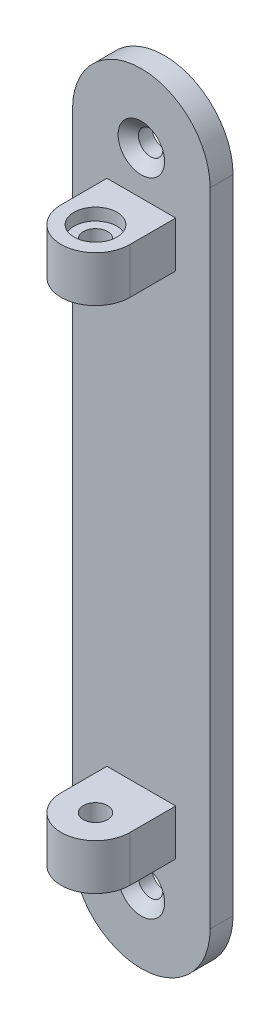
ISO-10303-21;
HEADER;
FILE_DESCRIPTION(('STEP AP214'),'2;1');
FILE_NAME('part.step','',(''),(''),'','','');
FILE_SCHEMA(('AUTOMOTIVE_DESIGN { 1 0 10303 214 1 1 1 1 }'));
ENDSEC;
DATA;
#1=APPLICATION_CONTEXT('core data for automotive mechanical design processes');
#2=APPLICATION_PROTOCOL_DEFINITION('international standard','automotive_design',2000,#1);
#3=PRODUCT_CONTEXT('',#1,'mechanical');
#4=PRODUCT('Part','Part','',(#3));
#5=PRODUCT_RELATED_PRODUCT_CATEGORY('part','',(#4));
#6=PRODUCT_DEFINITION_FORMATION('','',#4);
#7=PRODUCT_DEFINITION_CONTEXT('part definition',#1,'design');
#8=PRODUCT_DEFINITION('design','',#6,#7);
#9=PRODUCT_DEFINITION_SHAPE('','',#8);
#10=(LENGTH_UNIT() NAMED_UNIT(*) SI_UNIT(.MILLI.,.METRE.));
#11=(NAMED_UNIT(*) PLANE_ANGLE_UNIT() SI_UNIT($,.RADIAN.));
#12=(NAMED_UNIT(*) SI_UNIT($,.STERADIAN.) SOLID_ANGLE_UNIT());
#13=UNCERTAINTY_MEASURE_WITH_UNIT(LENGTH_MEASURE(1.E-05),#10,'distance_accuracy_value','');
#14=(GEOMETRIC_REPRESENTATION_CONTEXT(3) GLOBAL_UNCERTAINTY_ASSIGNED_CONTEXT((#13)) GLOBAL_UNIT_ASSIGNED_CONTEXT((#10,
#11,#12)) REPRESENTATION_CONTEXT('',''));
#15=CARTESIAN_POINT('',(0.,0.,0.));
#16=DIRECTION('',(0.,0.,1.));
#17=DIRECTION('',(1.,0.,0.));
#18=AXIS2_PLACEMENT_3D('',#15,#16,#17);
#19=CARTESIAN_POINT('',(9.525,64.1692599322858,19.05));
#20=DIRECTION('',(0.,1.,0.));
#21=DIRECTION('',(0.,0.,1.));
#22=AXIS2_PLACEMENT_3D('',#19,#20,#21);
#23=PLANE('',#22);
#24=DIRECTION('',(1.,0.,0.));
#25=VECTOR('',#24,1.);
#26=CARTESIAN_POINT('',(9.525,64.1692599322858,6.35));
#27=LINE('',#26,#25);
#28=CARTESIAN_POINT('',(9.525,64.1692599322858,6.35));
#29=VERTEX_POINT('',#28);
#30=CARTESIAN_POINT('',(28.575,64.1692599322858,6.35));
#31=VERTEX_POINT('',#30);
#32=EDGE_CURVE('E48',#29,#31,#27,.T.);
#33=ORIENTED_EDGE('',*,*,#32,.T.);
#34=DIRECTION('',(0.,0.,-1.));
#35=VECTOR('',#34,1.);
#36=CARTESIAN_POINT('',(28.575,64.1692599322858,19.05));
#37=LINE('',#36,#35);
#38=CARTESIAN_POINT('',(28.575,64.1692599322858,19.05));
#39=VERTEX_POINT('',#38);
#40=EDGE_CURVE('E225',#39,#31,#37,.T.);
#41=ORIENTED_EDGE('',*,*,#40,.F.);
#42=CARTESIAN_POINT('',(19.05,64.1692599322858,19.05));
#43=DIRECTION('',(0.,1.,0.));
#44=DIRECTION('',(0.,0.,1.));
#45=AXIS2_PLACEMENT_3D('',#42,#43,#44);
#46=CIRCLE('',#45,9.525);
#47=CARTESIAN_POINT('',(9.525,64.1692599322858,19.05));
#48=VERTEX_POINT('',#47);
#49=EDGE_CURVE('E200',#39,#48,#46,.F.);
#50=ORIENTED_EDGE('',*,*,#49,.T.);
#51=DIRECTION('',(0.,0.,-1.));
#52=VECTOR('',#51,1.);
#53=CARTESIAN_POINT('',(9.525,64.1692599322858,19.05));
#54=LINE('',#53,#52);
#55=EDGE_CURVE('E228',#48,#29,#54,.T.);
#56=ORIENTED_EDGE('',*,*,#55,.T.);
#57=EDGE_LOOP('',(#33,#41,#50,#56));
#58=FACE_BOUND('',#57,.T.);
#59=CARTESIAN_POINT('',(19.05,64.1692599322858,19.05));
#60=DIRECTION('',(0.,1.,0.));
#61=DIRECTION('',(0.,0.,1.));
#62=AXIS2_PLACEMENT_3D('',#59,#60,#61);
#63=CIRCLE('',#62,3.3782);
#64=CARTESIAN_POINT('',(19.05,64.1692599322858,22.4282));
#65=VERTEX_POINT('',#64);
#66=EDGE_CURVE('E188',#65,#65,#63,.F.);
#67=ORIENTED_EDGE('',*,*,#66,.F.);
#68=EDGE_LOOP('',(#67));
#69=FACE_BOUND('',#68,.T.);
#70=ADVANCED_FACE('F33',(#58,#69),#23,.F.);
#71=CARTESIAN_POINT('',(19.05,88.9,6.35));
#72=DIRECTION('',(0.,0.,-1.));
#73=DIRECTION('',(-1.,0.,0.));
#74=AXIS2_PLACEMENT_3D('',#71,#72,#73);
#75=PLANE('',#74);
#76=DIRECTION('',(0.,-1.,0.));
#77=VECTOR('',#76,1.);
#78=CARTESIAN_POINT('',(0.,0.,6.35));
#79=LINE('',#78,#77);
#80=CARTESIAN_POINT('',(0.,88.9,6.35));
#81=VERTEX_POINT('',#80);
#82=CARTESIAN_POINT('',(0.,-88.9,6.35));
#83=VERTEX_POINT('',#82);
#84=EDGE_CURVE('E245',#81,#83,#79,.T.);
#85=ORIENTED_EDGE('',*,*,#84,.T.);
#86=CARTESIAN_POINT('',(19.05,-88.9,6.35));
#87=DIRECTION('',(0.,0.,-1.));
#88=DIRECTION('',(-1.,0.,0.));
#89=AXIS2_PLACEMENT_3D('',#86,#87,#88);
#90=CIRCLE('',#89,19.05);
#91=CARTESIAN_POINT('',(38.1,-88.9,6.35));
#92=VERTEX_POINT('',#91);
#93=EDGE_CURVE('E176',#92,#83,#90,.T.);
#94=ORIENTED_EDGE('',*,*,#93,.F.);
#95=DIRECTION('',(0.,1.,0.));
#96=VECTOR('',#95,1.);
#97=CARTESIAN_POINT('',(38.1,88.9,6.35));
#98=LINE('',#97,#96);
#99=CARTESIAN_POINT('',(38.1,88.9,6.35));
#100=VERTEX_POINT('',#99);
#101=EDGE_CURVE('E240',#92,#100,#98,.T.);
#102=ORIENTED_EDGE('',*,*,#101,.T.);
#103=CARTESIAN_POINT('',(19.05,88.9,6.35));
#104=DIRECTION('',(0.,0.,1.));
#105=DIRECTION('',(-1.,0.,0.));
#106=AXIS2_PLACEMENT_3D('',#103,#104,#105);
#107=CIRCLE('',#106,19.05);
#108=EDGE_CURVE('E242',#100,#81,#107,.T.);
#109=ORIENTED_EDGE('',*,*,#108,.T.);
#110=EDGE_LOOP('',(#85,#94,#102,#109));
#111=FACE_BOUND('',#110,.T.);
#112=CARTESIAN_POINT('',(19.05,88.9,6.35));
#113=DIRECTION('',(0.,0.,1.));
#114=DIRECTION('',(1.,0.,0.));
#115=AXIS2_PLACEMENT_3D('',#112,#113,#114);
#116=CIRCLE('',#115,6.4389);
#117=CARTESIAN_POINT('',(25.4889,88.9,6.35));
#118=VERTEX_POINT('',#117);
#119=EDGE_CURVE('E230',#118,#118,#116,.T.);
#120=ORIENTED_EDGE('',*,*,#119,.F.);
#121=EDGE_LOOP('',(#120));
#122=FACE_BOUND('',#121,.T.);
#123=DIRECTION('',(0.,-1.,0.));
#124=VECTOR('',#123,1.);
#125=CARTESIAN_POINT('',(9.525,76.8692599322858,6.35));
#126=LINE('',#125,#124);
#127=CARTESIAN_POINT('',(9.525,76.8692599322858,6.35));
#128=VERTEX_POINT('',#127);
#129=EDGE_CURVE('E203',#128,#29,#126,.T.);
#130=ORIENTED_EDGE('',*,*,#129,.F.);
#131=DIRECTION('',(-1.,0.,0.));
#132=VECTOR('',#131,1.);
#133=CARTESIAN_POINT('',(9.525,76.8692599322858,6.35));
#134=LINE('',#133,#132);
#135=CARTESIAN_POINT('',(28.575,76.8692599322858,6.35));
#136=VERTEX_POINT('',#135);
#137=EDGE_CURVE('E210',#136,#128,#134,.T.);
#138=ORIENTED_EDGE('',*,*,#137,.F.);
#139=DIRECTION('',(0.,1.,0.));
#140=VECTOR('',#139,1.);
#141=CARTESIAN_POINT('',(28.575,76.8692599322858,6.35));
#142=LINE('',#141,#140);
#143=EDGE_CURVE('E53',#31,#136,#142,.T.);
#144=ORIENTED_EDGE('',*,*,#143,.F.);
#145=ORIENTED_EDGE('',*,*,#32,.F.);
#146=EDGE_LOOP('',(#130,#138,#144,#145));
#147=FACE_BOUND('',#146,.T.);
#148=CARTESIAN_POINT('',(19.05,-88.9,6.35));
#149=DIRECTION('',(0.,0.,-1.));
#150=DIRECTION('',(1.,0.,0.));
#151=AXIS2_PLACEMENT_3D('',#148,#149,#150);
#152=CIRCLE('',#151,6.4389);
#153=CARTESIAN_POINT('',(25.4889,-88.9,6.35));
#154=VERTEX_POINT('',#153);
#155=EDGE_CURVE('E166',#154,#154,#152,.T.);
#156=ORIENTED_EDGE('',*,*,#155,.T.);
#157=EDGE_LOOP('',(#156));
#158=FACE_BOUND('',#157,.T.);
#159=DIRECTION('',(0.,1.,0.));
#160=VECTOR('',#159,1.);
#161=CARTESIAN_POINT('',(9.52500000000002,-76.8692599322858,6.35));
#162=LINE('',#161,#160);
#163=CARTESIAN_POINT('',(9.52500000000002,-76.8692599322858,6.35));
#164=VERTEX_POINT('',#163);
#165=CARTESIAN_POINT('',(9.52500000000002,-64.1692599322858,6.35));
#166=VERTEX_POINT('',#165);
#167=EDGE_CURVE('E147',#164,#166,#162,.T.);
#168=ORIENTED_EDGE('',*,*,#167,.T.);
#169=DIRECTION('',(1.,0.,0.));
#170=VECTOR('',#169,1.);
#171=CARTESIAN_POINT('',(9.52500000000002,-64.1692599322858,6.35));
#172=LINE('',#171,#170);
#173=CARTESIAN_POINT('',(28.575,-64.1692599322858,6.35));
#174=VERTEX_POINT('',#173);
#175=EDGE_CURVE('E149',#166,#174,#172,.T.);
#176=ORIENTED_EDGE('',*,*,#175,.T.);
#177=DIRECTION('',(0.,-1.,0.));
#178=VECTOR('',#177,1.);
#179=CARTESIAN_POINT('',(28.575,-76.8692599322858,6.35));
#180=LINE('',#179,#178);
#181=CARTESIAN_POINT('',(28.575,-76.8692599322858,6.35));
#182=VERTEX_POINT('',#181);
#183=EDGE_CURVE('E137',#174,#182,#180,.T.);
#184=ORIENTED_EDGE('',*,*,#183,.T.);
#185=DIRECTION('',(-1.,0.,0.));
#186=VECTOR('',#185,1.);
#187=CARTESIAN_POINT('',(9.52500000000002,-76.8692599322858,6.35));
#188=LINE('',#187,#186);
#189=EDGE_CURVE('E157',#182,#164,#188,.T.);
#190=ORIENTED_EDGE('',*,*,#189,.T.);
#191=EDGE_LOOP('',(#168,#176,#184,#190));
#192=FACE_BOUND('',#191,.T.);
#193=ADVANCED_FACE('F271',(#111,#122,#147,#158,#192),#75,.F.);
#194=CARTESIAN_POINT('',(38.1,88.9,6.35));
#195=DIRECTION('',(-1.,0.,0.));
#196=DIRECTION('',(0.,-1.,0.));
#197=AXIS2_PLACEMENT_3D('',#194,#195,#196);
#198=PLANE('',#197);
#199=DIRECTION('',(0.,1.,0.));
#200=VECTOR('',#199,1.);
#201=CARTESIAN_POINT('',(38.1,88.9,0.));
#202=LINE('',#201,#200);
#203=CARTESIAN_POINT('',(38.1,-88.9,0.));
#204=VERTEX_POINT('',#203);
#205=CARTESIAN_POINT('',(38.1,88.9,0.));
#206=VERTEX_POINT('',#205);
#207=EDGE_CURVE('E239',#204,#206,#202,.T.);
#208=ORIENTED_EDGE('',*,*,#207,.T.);
#209=DIRECTION('',(0.,0.,-1.));
#210=VECTOR('',#209,1.);
#211=CARTESIAN_POINT('',(38.1,88.9,6.35));
#212=LINE('',#211,#210);
#213=EDGE_CURVE('E11',#100,#206,#212,.T.);
#214=ORIENTED_EDGE('',*,*,#213,.F.);
#215=ORIENTED_EDGE('',*,*,#101,.F.);
#216=DIRECTION('',(0.,0.,-1.));
#217=VECTOR('',#216,1.);
#218=CARTESIAN_POINT('',(38.1,-88.9,6.35));
#219=LINE('',#218,#217);
#220=EDGE_CURVE('E184',#92,#204,#219,.T.);
#221=ORIENTED_EDGE('',*,*,#220,.T.);
#222=EDGE_LOOP('',(#208,#214,#215,#221));
#223=FACE_BOUND('',#222,.T.);
#224=ADVANCED_FACE('F35',(#223),#198,.F.);
#225=CARTESIAN_POINT('',(19.05,88.9,6.35));
#226=DIRECTION('',(0.,0.,-1.));
#227=DIRECTION('',(-1.,0.,0.));
#228=AXIS2_PLACEMENT_3D('',#225,#226,#227);
#229=CYLINDRICAL_SURFACE('',#228,19.05);
#230=CARTESIAN_POINT('',(19.05,88.9,0.));
#231=DIRECTION('',(0.,0.,1.));
#232=DIRECTION('',(-1.,0.,0.));
#233=AXIS2_PLACEMENT_3D('',#230,#231,#232);
#234=CIRCLE('',#233,19.05);
#235=CARTESIAN_POINT('',(0.,88.9,0.));
#236=VERTEX_POINT('',#235);
#237=EDGE_CURVE('E248',#206,#236,#234,.T.);
#238=ORIENTED_EDGE('',*,*,#237,.T.);
#239=DIRECTION('',(0.,0.,-1.));
#240=VECTOR('',#239,1.);
#241=CARTESIAN_POINT('',(0.,88.9,6.35));
#242=LINE('',#241,#240);
#243=EDGE_CURVE('E41',#81,#236,#242,.T.);
#244=ORIENTED_EDGE('',*,*,#243,.F.);
#245=ORIENTED_EDGE('',*,*,#108,.F.);
#246=ORIENTED_EDGE('',*,*,#213,.T.);
#247=EDGE_LOOP('',(#238,#244,#245,#246));
#248=FACE_BOUND('',#247,.T.);
#249=ADVANCED_FACE('F273',(#248),#229,.T.);
#250=CARTESIAN_POINT('',(0.,0.,6.35));
#251=DIRECTION('',(1.,0.,0.));
#252=DIRECTION('',(0.,0.,-1.));
#253=AXIS2_PLACEMENT_3D('',#250,#251,#252);
#254=PLANE('',#253);
#255=DIRECTION('',(0.,-1.,0.));
#256=VECTOR('',#255,1.);
#257=CARTESIAN_POINT('',(0.,0.,0.));
#258=LINE('',#257,#256);
#259=CARTESIAN_POINT('',(0.,-88.9,0.));
#260=VERTEX_POINT('',#259);
#261=EDGE_CURVE('E243',#236,#260,#258,.T.);
#262=ORIENTED_EDGE('',*,*,#261,.T.);
#263=DIRECTION('',(0.,0.,-1.));
#264=VECTOR('',#263,1.);
#265=CARTESIAN_POINT('',(0.,-88.9,6.35));
#266=LINE('',#265,#264);
#267=EDGE_CURVE('E179',#83,#260,#266,.T.);
#268=ORIENTED_EDGE('',*,*,#267,.F.);
#269=ORIENTED_EDGE('',*,*,#84,.F.);
#270=ORIENTED_EDGE('',*,*,#243,.T.);
#271=EDGE_LOOP('',(#262,#268,#269,#270));
#272=FACE_BOUND('',#271,.T.);
#273=ADVANCED_FACE('F255',(#272),#254,.F.);
#274=CARTESIAN_POINT('',(19.05,88.9,0.));
#275=DIRECTION('',(0.,0.,-1.));
#276=DIRECTION('',(-1.,0.,0.));
#277=AXIS2_PLACEMENT_3D('',#274,#275,#276);
#278=PLANE('',#277);
#279=CARTESIAN_POINT('',(19.05,88.9,0.));
#280=DIRECTION('',(0.,0.,1.));
#281=DIRECTION('',(1.,0.,0.));
#282=AXIS2_PLACEMENT_3D('',#279,#280,#281);
#283=CIRCLE('',#282,3.3782);
#284=CARTESIAN_POINT('',(22.4282,88.9,0.));
#285=VERTEX_POINT('',#284);
#286=EDGE_CURVE('E236',#285,#285,#283,.T.);
#287=ORIENTED_EDGE('',*,*,#286,.T.);
#288=EDGE_LOOP('',(#287));
#289=FACE_BOUND('',#288,.T.);
#290=ORIENTED_EDGE('',*,*,#207,.F.);
#291=CARTESIAN_POINT('',(19.05,-88.9,0.));
#292=DIRECTION('',(0.,0.,-1.));
#293=DIRECTION('',(-1.,0.,0.));
#294=AXIS2_PLACEMENT_3D('',#291,#292,#293);
#295=CIRCLE('',#294,19.05);
#296=EDGE_CURVE('E175',#204,#260,#295,.T.);
#297=ORIENTED_EDGE('',*,*,#296,.T.);
#298=ORIENTED_EDGE('',*,*,#261,.F.);
#299=ORIENTED_EDGE('',*,*,#237,.F.);
#300=EDGE_LOOP('',(#290,#297,#298,#299));
#301=FACE_BOUND('',#300,.T.);
#302=CARTESIAN_POINT('',(19.05,-88.9,0.));
#303=DIRECTION('',(0.,0.,-1.));
#304=DIRECTION('',(1.,0.,0.));
#305=AXIS2_PLACEMENT_3D('',#302,#303,#304);
#306=CIRCLE('',#305,3.3782);
#307=CARTESIAN_POINT('',(22.4282,-88.9,0.));
#308=VERTEX_POINT('',#307);
#309=EDGE_CURVE('E172',#308,#308,#306,.T.);
#310=ORIENTED_EDGE('',*,*,#309,.F.);
#311=EDGE_LOOP('',(#310));
#312=FACE_BOUND('',#311,.T.);
#313=ADVANCED_FACE('F261',(#289,#301,#312),#278,.T.);
#314=CARTESIAN_POINT('',(19.05,88.9,6.35));
#315=DIRECTION('',(0.,0.,1.));
#316=DIRECTION('',(1.,0.,0.));
#317=AXIS2_PLACEMENT_3D('',#314,#315,#316);
#318=CYLINDRICAL_SURFACE('',#317,3.3782);
#319=ORIENTED_EDGE('',*,*,#286,.F.);
#320=EDGE_LOOP('',(#319));
#321=FACE_BOUND('',#320,.T.);
#322=CARTESIAN_POINT('',(19.05,88.9,3.7817677588557));
#323=DIRECTION('',(0.,0.,1.));
#324=DIRECTION('',(1.,0.,0.));
#325=AXIS2_PLACEMENT_3D('',#322,#323,#324);
#326=CIRCLE('',#325,3.3782);
#327=CARTESIAN_POINT('',(22.4282,88.9,3.7817677588557));
#328=VERTEX_POINT('',#327);
#329=EDGE_CURVE('E233',#328,#328,#326,.T.);
#330=ORIENTED_EDGE('',*,*,#329,.T.);
#331=EDGE_LOOP('',(#330));
#332=FACE_BOUND('',#331,.T.);
#333=ADVANCED_FACE('F299',(#321,#332),#318,.F.);
#334=CARTESIAN_POINT('',(19.05,88.9,6.35));
#335=DIRECTION('',(0.,0.,1.));
#336=DIRECTION('',(1.,0.,0.));
#337=AXIS2_PLACEMENT_3D('',#334,#335,#336);
#338=CONICAL_SURFACE('',#337,6.4389,0.872664625997164);
#339=ORIENTED_EDGE('',*,*,#329,.F.);
#340=EDGE_LOOP('',(#339));
#341=FACE_BOUND('',#340,.T.);
#342=ORIENTED_EDGE('',*,*,#119,.T.);
#343=EDGE_LOOP('',(#342));
#344=FACE_BOUND('',#343,.T.);
#345=ADVANCED_FACE('F295',(#341,#344),#338,.F.);
#346=CARTESIAN_POINT('',(9.525,76.8692599322858,19.05));
#347=DIRECTION('',(1.,0.,0.));
#348=DIRECTION('',(0.,1.,0.));
#349=AXIS2_PLACEMENT_3D('',#346,#347,#348);
#350=PLANE('',#349);
#351=ORIENTED_EDGE('',*,*,#129,.T.);
#352=ORIENTED_EDGE('',*,*,#55,.F.);
#353=DIRECTION('',(0.,-1.,0.));
#354=VECTOR('',#353,1.);
#355=CARTESIAN_POINT('',(9.525,76.8692599322858,19.05));
#356=LINE('',#355,#354);
#357=CARTESIAN_POINT('',(9.525,76.8692599322858,19.05));
#358=VERTEX_POINT('',#357);
#359=EDGE_CURVE('E206',#358,#48,#356,.T.);
#360=ORIENTED_EDGE('',*,*,#359,.F.);
#361=DIRECTION('',(0.,0.,-1.));
#362=VECTOR('',#361,1.);
#363=CARTESIAN_POINT('',(9.525,76.8692599322858,19.05));
#364=LINE('',#363,#362);
#365=EDGE_CURVE('E213',#358,#128,#364,.T.);
#366=ORIENTED_EDGE('',*,*,#365,.T.);
#367=EDGE_LOOP('',(#351,#352,#360,#366));
#368=FACE_BOUND('',#367,.T.);
#369=ADVANCED_FACE('F292',(#368),#350,.F.);
#370=CARTESIAN_POINT('',(28.575,76.8692599322858,19.05));
#371=DIRECTION('',(-1.,0.,0.));
#372=DIRECTION('',(0.,-1.,0.));
#373=AXIS2_PLACEMENT_3D('',#370,#371,#372);
#374=PLANE('',#373);
#375=ORIENTED_EDGE('',*,*,#143,.T.);
#376=DIRECTION('',(0.,0.,-1.));
#377=VECTOR('',#376,1.);
#378=CARTESIAN_POINT('',(28.575,76.8692599322858,19.05));
#379=LINE('',#378,#377);
#380=CARTESIAN_POINT('',(28.575,76.8692599322858,19.05));
#381=VERTEX_POINT('',#380);
#382=EDGE_CURVE('E222',#381,#136,#379,.T.);
#383=ORIENTED_EDGE('',*,*,#382,.F.);
#384=DIRECTION('',(0.,1.,0.));
#385=VECTOR('',#384,1.);
#386=CARTESIAN_POINT('',(28.575,76.8692599322858,19.05));
#387=LINE('',#386,#385);
#388=EDGE_CURVE('E209',#39,#381,#387,.T.);
#389=ORIENTED_EDGE('',*,*,#388,.F.);
#390=ORIENTED_EDGE('',*,*,#40,.T.);
#391=EDGE_LOOP('',(#375,#383,#389,#390));
#392=FACE_BOUND('',#391,.T.);
#393=ADVANCED_FACE('F290',(#392),#374,.F.);
#394=CARTESIAN_POINT('',(9.525,76.8692599322858,19.05));
#395=DIRECTION('',(0.,-1.,0.));
#396=DIRECTION('',(0.,0.,-1.));
#397=AXIS2_PLACEMENT_3D('',#394,#395,#396);
#398=PLANE('',#397);
#399=CARTESIAN_POINT('',(19.05,76.8692599322858,19.05));
#400=DIRECTION('',(0.,1.,0.));
#401=DIRECTION('',(0.,0.,1.));
#402=AXIS2_PLACEMENT_3D('',#399,#400,#401);
#403=CIRCLE('',#402,5.95376);
#404=CARTESIAN_POINT('',(19.05,76.8692599322858,25.00376));
#405=VERTEX_POINT('',#404);
#406=EDGE_CURVE('E187',#405,#405,#403,.T.);
#407=ORIENTED_EDGE('',*,*,#406,.F.);
#408=EDGE_LOOP('',(#407));
#409=FACE_BOUND('',#408,.T.);
#410=ORIENTED_EDGE('',*,*,#137,.T.);
#411=ORIENTED_EDGE('',*,*,#365,.F.);
#412=CARTESIAN_POINT('',(19.05,76.8692599322858,19.05));
#413=DIRECTION('',(0.,1.,0.));
#414=DIRECTION('',(0.,0.,1.));
#415=AXIS2_PLACEMENT_3D('',#412,#413,#414);
#416=CIRCLE('',#415,9.525);
#417=EDGE_CURVE('E191',#358,#381,#416,.T.);
#418=ORIENTED_EDGE('',*,*,#417,.T.);
#419=ORIENTED_EDGE('',*,*,#382,.T.);
#420=EDGE_LOOP('',(#410,#411,#418,#419));
#421=FACE_BOUND('',#420,.T.);
#422=ADVANCED_FACE('F364',(#409,#421),#398,.F.);
#423=CARTESIAN_POINT('',(19.05,42.8707124466003,19.05));
#424=DIRECTION('',(0.,1.,0.));
#425=DIRECTION('',(0.,0.,1.));
#426=AXIS2_PLACEMENT_3D('',#423,#424,#425);
#427=CYLINDRICAL_SURFACE('',#426,9.525);
#428=ORIENTED_EDGE('',*,*,#49,.F.);
#429=ORIENTED_EDGE('',*,*,#388,.T.);
#430=ORIENTED_EDGE('',*,*,#417,.F.);
#431=ORIENTED_EDGE('',*,*,#359,.T.);
#432=EDGE_LOOP('',(#428,#429,#430,#431));
#433=FACE_BOUND('',#432,.T.);
#434=ADVANCED_FACE('F361',(#433),#427,.T.);
#435=CARTESIAN_POINT('',(19.05,76.8692599322858,19.05));
#436=DIRECTION('',(0.,1.,0.));
#437=DIRECTION('',(0.,0.,1.));
#438=AXIS2_PLACEMENT_3D('',#435,#436,#437);
#439=CYLINDRICAL_SURFACE('',#438,3.3782);
#440=ORIENTED_EDGE('',*,*,#66,.T.);
#441=EDGE_LOOP('',(#440));
#442=FACE_BOUND('',#441,.T.);
#443=CARTESIAN_POINT('',(19.05,73.5164599322858,19.05));
#444=DIRECTION('',(0.,1.,0.));
#445=DIRECTION('',(0.,0.,1.));
#446=AXIS2_PLACEMENT_3D('',#443,#444,#445);
#447=CIRCLE('',#446,3.3782);
#448=CARTESIAN_POINT('',(19.05,73.5164599322858,22.4282));
#449=VERTEX_POINT('',#448);
#450=EDGE_CURVE('E192',#449,#449,#447,.T.);
#451=ORIENTED_EDGE('',*,*,#450,.T.);
#452=EDGE_LOOP('',(#451));
#453=FACE_BOUND('',#452,.T.);
#454=ADVANCED_FACE('F357',(#442,#453),#439,.F.);
#455=CARTESIAN_POINT('',(22.4282,73.5164599322858,19.05));
#456=DIRECTION('',(0.,-1.,0.));
#457=DIRECTION('',(0.,0.,-1.));
#458=AXIS2_PLACEMENT_3D('',#455,#456,#457);
#459=PLANE('',#458);
#460=ORIENTED_EDGE('',*,*,#450,.F.);
#461=EDGE_LOOP('',(#460));
#462=FACE_BOUND('',#461,.T.);
#463=CARTESIAN_POINT('',(19.05,73.5164599322858,19.05));
#464=DIRECTION('',(0.,1.,0.));
#465=DIRECTION('',(0.,0.,1.));
#466=AXIS2_PLACEMENT_3D('',#463,#464,#465);
#467=CIRCLE('',#466,5.95376);
#468=CARTESIAN_POINT('',(19.05,73.5164599322858,25.00376));
#469=VERTEX_POINT('',#468);
#470=EDGE_CURVE('E195',#469,#469,#467,.T.);
#471=ORIENTED_EDGE('',*,*,#470,.T.);
#472=EDGE_LOOP('',(#471));
#473=FACE_BOUND('',#472,.T.);
#474=ADVANCED_FACE('F353',(#462,#473),#459,.F.);
#475=CARTESIAN_POINT('',(19.05,76.8692599322858,19.05));
#476=DIRECTION('',(0.,1.,0.));
#477=DIRECTION('',(0.,0.,1.));
#478=AXIS2_PLACEMENT_3D('',#475,#476,#477);
#479=CYLINDRICAL_SURFACE('',#478,5.95376);
#480=ORIENTED_EDGE('',*,*,#470,.F.);
#481=EDGE_LOOP('',(#480));
#482=FACE_BOUND('',#481,.T.);
#483=ORIENTED_EDGE('',*,*,#406,.T.);
#484=EDGE_LOOP('',(#483));
#485=FACE_BOUND('',#484,.T.);
#486=ADVANCED_FACE('F338',(#482,#485),#479,.F.);
#487=CARTESIAN_POINT('',(9.52500000000002,-64.1692599322858,19.05));
#488=DIRECTION('',(0.,-1.,0.));
#489=DIRECTION('',(0.,0.,1.));
#490=AXIS2_PLACEMENT_3D('',#487,#488,#489);
#491=PLANE('',#490);
#492=ORIENTED_EDGE('',*,*,#175,.F.);
#493=DIRECTION('',(0.,0.,-1.));
#494=VECTOR('',#493,1.);
#495=CARTESIAN_POINT('',(9.52500000000002,-64.1692599322858,19.05));
#496=LINE('',#495,#494);
#497=CARTESIAN_POINT('',(9.52500000000002,-64.1692599322858,19.05));
#498=VERTEX_POINT('',#497);
#499=EDGE_CURVE('E141',#498,#166,#496,.T.);
#500=ORIENTED_EDGE('',*,*,#499,.F.);
#501=CARTESIAN_POINT('',(19.05,-64.1692599322858,19.05));
#502=DIRECTION('',(0.,1.,0.));
#503=DIRECTION('',(0.,0.,1.));
#504=AXIS2_PLACEMENT_3D('',#501,#502,#503);
#505=CIRCLE('',#504,9.525);
#506=CARTESIAN_POINT('',(28.575,-64.1692599322858,19.05));
#507=VERTEX_POINT('',#506);
#508=EDGE_CURVE('E125',#507,#498,#505,.F.);
#509=ORIENTED_EDGE('',*,*,#508,.F.);
#510=DIRECTION('',(0.,0.,-1.));
#511=VECTOR('',#510,1.);
#512=CARTESIAN_POINT('',(28.575,-64.1692599322858,19.05));
#513=LINE('',#512,#511);
#514=EDGE_CURVE('E134',#507,#174,#513,.T.);
#515=ORIENTED_EDGE('',*,*,#514,.T.);
#516=EDGE_LOOP('',(#492,#500,#509,#515));
#517=FACE_BOUND('',#516,.T.);
#518=CARTESIAN_POINT('',(19.05,-64.1692599322858,19.05));
#519=DIRECTION('',(0.,1.,0.));
#520=DIRECTION('',(0.,0.,1.));
#521=AXIS2_PLACEMENT_3D('',#518,#519,#520);
#522=CIRCLE('',#521,3.3782);
#523=CARTESIAN_POINT('',(19.05,-64.1692599322858,22.4282));
#524=VERTEX_POINT('',#523);
#525=EDGE_CURVE('E151',#524,#524,#522,.F.);
#526=ORIENTED_EDGE('',*,*,#525,.T.);
#527=EDGE_LOOP('',(#526));
#528=FACE_BOUND('',#527,.T.);
#529=ADVANCED_FACE('F144',(#517,#528),#491,.F.);
#530=CARTESIAN_POINT('',(19.05,-88.9,6.35));
#531=DIRECTION('',(0.,0.,-1.));
#532=DIRECTION('',(-1.,0.,0.));
#533=AXIS2_PLACEMENT_3D('',#530,#531,#532);
#534=CYLINDRICAL_SURFACE('',#533,19.05);
#535=ORIENTED_EDGE('',*,*,#296,.F.);
#536=ORIENTED_EDGE('',*,*,#220,.F.);
#537=ORIENTED_EDGE('',*,*,#93,.T.);
#538=ORIENTED_EDGE('',*,*,#267,.T.);
#539=EDGE_LOOP('',(#535,#536,#537,#538));
#540=FACE_BOUND('',#539,.T.);
#541=ADVANCED_FACE('F266',(#540),#534,.T.);
#542=CARTESIAN_POINT('',(19.05,-88.9,6.35));
#543=DIRECTION('',(0.,0.,1.));
#544=DIRECTION('',(1.,0.,0.));
#545=AXIS2_PLACEMENT_3D('',#542,#543,#544);
#546=CYLINDRICAL_SURFACE('',#545,3.3782);
#547=ORIENTED_EDGE('',*,*,#309,.T.);
#548=EDGE_LOOP('',(#547));
#549=FACE_BOUND('',#548,.T.);
#550=CARTESIAN_POINT('',(19.05,-88.9,3.7817677588557));
#551=DIRECTION('',(0.,0.,-1.));
#552=DIRECTION('',(1.,0.,0.));
#553=AXIS2_PLACEMENT_3D('',#550,#551,#552);
#554=CIRCLE('',#553,3.3782);
#555=CARTESIAN_POINT('',(22.4282,-88.9,3.7817677588557));
#556=VERTEX_POINT('',#555);
#557=EDGE_CURVE('E169',#556,#556,#554,.T.);
#558=ORIENTED_EDGE('',*,*,#557,.F.);
#559=EDGE_LOOP('',(#558));
#560=FACE_BOUND('',#559,.T.);
#561=ADVANCED_FACE('F344',(#549,#560),#546,.F.);
#562=CARTESIAN_POINT('',(19.05,-88.9,6.35));
#563=DIRECTION('',(0.,0.,1.));
#564=DIRECTION('',(1.,0.,0.));
#565=AXIS2_PLACEMENT_3D('',#562,#563,#564);
#566=CONICAL_SURFACE('',#565,6.4389,0.872664625997164);
#567=ORIENTED_EDGE('',*,*,#557,.T.);
#568=EDGE_LOOP('',(#567));
#569=FACE_BOUND('',#568,.T.);
#570=ORIENTED_EDGE('',*,*,#155,.F.);
#571=EDGE_LOOP('',(#570));
#572=FACE_BOUND('',#571,.T.);
#573=ADVANCED_FACE('F341',(#569,#572),#566,.F.);
#574=CARTESIAN_POINT('',(9.52500000000002,-76.8692599322858,19.05));
#575=DIRECTION('',(1.,0.,0.));
#576=DIRECTION('',(0.,-1.,0.));
#577=AXIS2_PLACEMENT_3D('',#574,#575,#576);
#578=PLANE('',#577);
#579=ORIENTED_EDGE('',*,*,#167,.F.);
#580=DIRECTION('',(0.,0.,-1.));
#581=VECTOR('',#580,1.);
#582=CARTESIAN_POINT('',(9.52500000000002,-76.8692599322858,19.05));
#583=LINE('',#582,#581);
#584=CARTESIAN_POINT('',(9.52500000000002,-76.8692599322858,19.05));
#585=VERTEX_POINT('',#584);
#586=EDGE_CURVE('E130',#585,#164,#583,.T.);
#587=ORIENTED_EDGE('',*,*,#586,.F.);
#588=DIRECTION('',(0.,1.,0.));
#589=VECTOR('',#588,1.);
#590=CARTESIAN_POINT('',(9.52500000000002,-76.8692599322858,19.05));
#591=LINE('',#590,#589);
#592=EDGE_CURVE('E131',#585,#498,#591,.T.);
#593=ORIENTED_EDGE('',*,*,#592,.T.);
#594=ORIENTED_EDGE('',*,*,#499,.T.);
#595=EDGE_LOOP('',(#579,#587,#593,#594));
#596=FACE_BOUND('',#595,.T.);
#597=ADVANCED_FACE('F320',(#596),#578,.F.);
#598=CARTESIAN_POINT('',(28.575,-76.8692599322858,19.05));
#599=DIRECTION('',(-1.,0.,0.));
#600=DIRECTION('',(0.,1.,0.));
#601=AXIS2_PLACEMENT_3D('',#598,#599,#600);
#602=PLANE('',#601);
#603=ORIENTED_EDGE('',*,*,#183,.F.);
#604=ORIENTED_EDGE('',*,*,#514,.F.);
#605=DIRECTION('',(0.,-1.,0.));
#606=VECTOR('',#605,1.);
#607=CARTESIAN_POINT('',(28.575,-76.8692599322858,19.05));
#608=LINE('',#607,#606);
#609=CARTESIAN_POINT('',(28.575,-76.8692599322858,19.05));
#610=VERTEX_POINT('',#609);
#611=EDGE_CURVE('E120',#507,#610,#608,.T.);
#612=ORIENTED_EDGE('',*,*,#611,.T.);
#613=DIRECTION('',(0.,0.,-1.));
#614=VECTOR('',#613,1.);
#615=CARTESIAN_POINT('',(28.575,-76.8692599322858,19.05));
#616=LINE('',#615,#614);
#617=EDGE_CURVE('E142',#610,#182,#616,.T.);
#618=ORIENTED_EDGE('',*,*,#617,.T.);
#619=EDGE_LOOP('',(#603,#604,#612,#618));
#620=FACE_BOUND('',#619,.T.);
#621=ADVANCED_FACE('F135',(#620),#602,.F.);
#622=CARTESIAN_POINT('',(9.52500000000002,-76.8692599322858,19.05));
#623=DIRECTION('',(0.,1.,0.));
#624=DIRECTION('',(0.,0.,-1.));
#625=AXIS2_PLACEMENT_3D('',#622,#623,#624);
#626=PLANE('',#625);
#627=CARTESIAN_POINT('',(19.05,-76.8692599322858,19.05));
#628=DIRECTION('',(0.,1.,0.));
#629=DIRECTION('',(0.,0.,1.));
#630=AXIS2_PLACEMENT_3D('',#627,#628,#629);
#631=CIRCLE('',#630,5.95376);
#632=CARTESIAN_POINT('',(19.05,-76.8692599322858,25.00376));
#633=VERTEX_POINT('',#632);
#634=EDGE_CURVE('E533',#633,#633,#631,.T.);
#635=ORIENTED_EDGE('',*,*,#634,.T.);
#636=EDGE_LOOP('',(#635));
#637=FACE_BOUND('',#636,.T.);
#638=ORIENTED_EDGE('',*,*,#189,.F.);
#639=ORIENTED_EDGE('',*,*,#617,.F.);
#640=CARTESIAN_POINT('',(19.05,-76.8692599322858,19.05));
#641=DIRECTION('',(0.,1.,0.));
#642=DIRECTION('',(0.,0.,1.));
#643=AXIS2_PLACEMENT_3D('',#640,#641,#642);
#644=CIRCLE('',#643,9.525);
#645=EDGE_CURVE('E127',#585,#610,#644,.T.);
#646=ORIENTED_EDGE('',*,*,#645,.F.);
#647=ORIENTED_EDGE('',*,*,#586,.T.);
#648=EDGE_LOOP('',(#638,#639,#646,#647));
#649=FACE_BOUND('',#648,.T.);
#650=ADVANCED_FACE('F322',(#637,#649),#626,.F.);
#651=CARTESIAN_POINT('',(19.05,-42.8707124466003,19.05));
#652=DIRECTION('',(0.,-1.,0.));
#653=DIRECTION('',(0.,0.,1.));
#654=AXIS2_PLACEMENT_3D('',#651,#652,#653);
#655=CYLINDRICAL_SURFACE('',#654,9.525);
#656=ORIENTED_EDGE('',*,*,#508,.T.);
#657=ORIENTED_EDGE('',*,*,#592,.F.);
#658=ORIENTED_EDGE('',*,*,#645,.T.);
#659=ORIENTED_EDGE('',*,*,#611,.F.);
#660=EDGE_LOOP('',(#656,#657,#658,#659));
#661=FACE_BOUND('',#660,.T.);
#662=ADVANCED_FACE('F122',(#661),#655,.T.);
#663=CARTESIAN_POINT('',(19.05,-76.8692599322858,19.05));
#664=DIRECTION('',(0.,-1.,0.));
#665=DIRECTION('',(0.,0.,1.));
#666=AXIS2_PLACEMENT_3D('',#663,#664,#665);
#667=CYLINDRICAL_SURFACE('',#666,3.3782);
#668=ORIENTED_EDGE('',*,*,#525,.F.);
#669=EDGE_LOOP('',(#668));
#670=FACE_BOUND('',#669,.T.);
#671=CARTESIAN_POINT('',(19.05,-73.5164599322858,19.05));
#672=DIRECTION('',(0.,1.,0.));
#673=DIRECTION('',(0.,0.,1.));
#674=AXIS2_PLACEMENT_3D('',#671,#672,#673);
#675=CIRCLE('',#674,3.3782);
#676=CARTESIAN_POINT('',(19.05,-73.5164599322858,22.4282));
#677=VERTEX_POINT('',#676);
#678=EDGE_CURVE('E154',#677,#677,#675,.T.);
#679=ORIENTED_EDGE('',*,*,#678,.F.);
#680=EDGE_LOOP('',(#679));
#681=FACE_BOUND('',#680,.T.);
#682=ADVANCED_FACE('F330',(#670,#681),#667,.F.);
#683=CARTESIAN_POINT('',(22.4282,-73.5164599322858,19.05));
#684=DIRECTION('',(0.,1.,0.));
#685=DIRECTION('',(0.,0.,-1.));
#686=AXIS2_PLACEMENT_3D('',#683,#684,#685);
#687=PLANE('',#686);
#688=ORIENTED_EDGE('',*,*,#678,.T.);
#689=EDGE_LOOP('',(#688));
#690=FACE_BOUND('',#689,.T.);
#691=CARTESIAN_POINT('',(19.05,-73.5164599322858,19.05));
#692=DIRECTION('',(0.,1.,0.));
#693=DIRECTION('',(0.,0.,1.));
#694=AXIS2_PLACEMENT_3D('',#691,#692,#693);
#695=CIRCLE('',#694,5.95376);
#696=CARTESIAN_POINT('',(19.05,-73.5164599322858,25.00376));
#697=VERTEX_POINT('',#696);
#698=EDGE_CURVE('E531',#697,#697,#695,.T.);
#699=ORIENTED_EDGE('',*,*,#698,.F.);
#700=EDGE_LOOP('',(#699));
#701=FACE_BOUND('',#700,.T.);
#702=ADVANCED_FACE('F505',(#690,#701),#687,.F.);
#703=CARTESIAN_POINT('',(19.05,-76.8692599322858,19.05));
#704=DIRECTION('',(0.,-1.,0.));
#705=DIRECTION('',(0.,0.,1.));
#706=AXIS2_PLACEMENT_3D('',#703,#704,#705);
#707=CYLINDRICAL_SURFACE('',#706,5.95376);
#708=ORIENTED_EDGE('',*,*,#698,.T.);
#709=EDGE_LOOP('',(#708));
#710=FACE_BOUND('',#709,.T.);
#711=ORIENTED_EDGE('',*,*,#634,.F.);
#712=EDGE_LOOP('',(#711));
#713=FACE_BOUND('',#712,.T.);
#714=ADVANCED_FACE('F514',(#710,#713),#707,.F.);
#715=CLOSED_SHELL('',(#70,#193,#224,#249,#273,#313,#333,#345,#369,#393,#422,#434,#454,#474,#486,
#529,#541,#561,#573,#597,#621,#650,#662,#682,#702,#714));
#716=MANIFOLD_SOLID_BREP('B2',#715);
#717=ADVANCED_BREP_SHAPE_REPRESENTATION('',(#18,#716),#14);
#718=SHAPE_DEFINITION_REPRESENTATION(#9,#717);
ENDSEC;
END-ISO-10303-21;
